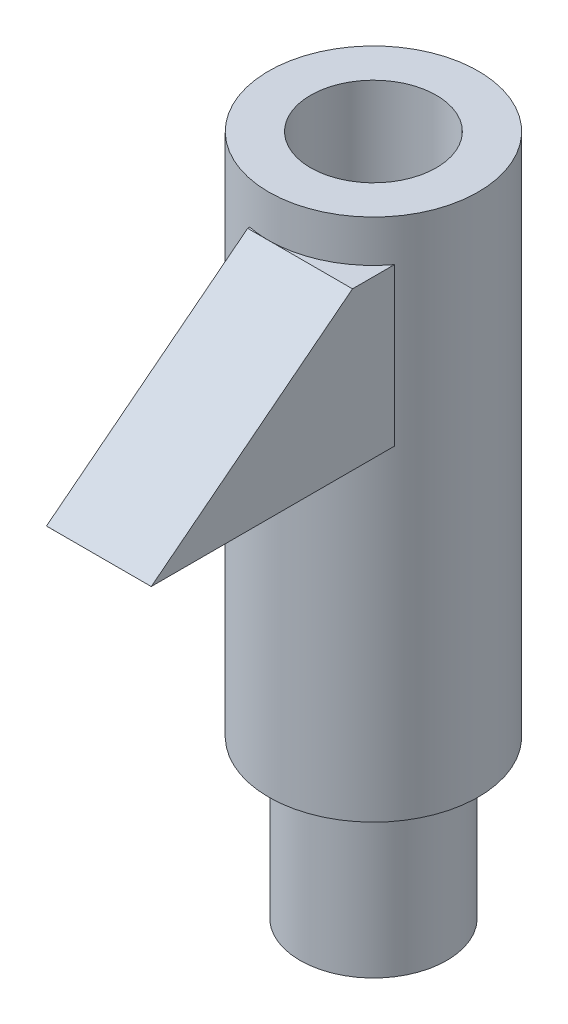
ISO-10303-21;
HEADER;
FILE_DESCRIPTION(('STEP AP214'),'2;1');
FILE_NAME('part.step','',(''),(''),'','','');
FILE_SCHEMA(('AUTOMOTIVE_DESIGN { 1 0 10303 214 1 1 1 1 }'));
ENDSEC;
DATA;
#1=APPLICATION_CONTEXT('core data for automotive mechanical design processes');
#2=APPLICATION_PROTOCOL_DEFINITION('international standard','automotive_design',2000,#1);
#3=PRODUCT_CONTEXT('',#1,'mechanical');
#4=PRODUCT('Part','Part','',(#3));
#5=PRODUCT_RELATED_PRODUCT_CATEGORY('part','',(#4));
#6=PRODUCT_DEFINITION_FORMATION('','',#4);
#7=PRODUCT_DEFINITION_CONTEXT('part definition',#1,'design');
#8=PRODUCT_DEFINITION('design','',#6,#7);
#9=PRODUCT_DEFINITION_SHAPE('','',#8);
#10=(LENGTH_UNIT() NAMED_UNIT(*) SI_UNIT(.MILLI.,.METRE.));
#11=(NAMED_UNIT(*) PLANE_ANGLE_UNIT() SI_UNIT($,.RADIAN.));
#12=(NAMED_UNIT(*) SI_UNIT($,.STERADIAN.) SOLID_ANGLE_UNIT());
#13=UNCERTAINTY_MEASURE_WITH_UNIT(LENGTH_MEASURE(1.E-05),#10,'distance_accuracy_value','');
#14=(GEOMETRIC_REPRESENTATION_CONTEXT(3) GLOBAL_UNCERTAINTY_ASSIGNED_CONTEXT((#13)) GLOBAL_UNIT_ASSIGNED_CONTEXT((#10,
#11,#12)) REPRESENTATION_CONTEXT('',''));
#15=CARTESIAN_POINT('',(0.,0.,0.));
#16=DIRECTION('',(0.,0.,1.));
#17=DIRECTION('',(1.,0.,0.));
#18=AXIS2_PLACEMENT_3D('',#15,#16,#17);
#19=CARTESIAN_POINT('',(-2.,61.,4.));
#20=DIRECTION('',(0.,1.,0.));
#21=DIRECTION('',(0.,0.,1.));
#22=AXIS2_PLACEMENT_3D('',#19,#20,#21);
#23=PLANE('',#22);
#24=DIRECTION('',(0.,0.,1.));
#25=VECTOR('',#24,1.);
#26=CARTESIAN_POINT('',(-2.,61.,4.));
#27=LINE('',#26,#25);
#28=CARTESIAN_POINT('',(-2.,61.,9.79795897113271));
#29=VERTEX_POINT('',#28);
#30=CARTESIAN_POINT('',(-2.,61.,9.99999999999983));
#31=VERTEX_POINT('',#30);
#32=EDGE_CURVE('E86',#29,#31,#27,.T.);
#33=ORIENTED_EDGE('',*,*,#32,.T.);
#34=DIRECTION('',(1.,0.,0.));
#35=VECTOR('',#34,1.);
#36=CARTESIAN_POINT('',(8.,61.,9.99999999999983));
#37=LINE('',#36,#35);
#38=CARTESIAN_POINT('',(0.,61.,9.99999999999983));
#39=VERTEX_POINT('',#38);
#40=EDGE_CURVE('E48',#31,#39,#37,.T.);
#41=ORIENTED_EDGE('',*,*,#40,.T.);
#42=CARTESIAN_POINT('',(0.,61.,0.));
#43=DIRECTION('',(0.,1.,0.));
#44=DIRECTION('',(0.,0.,1.));
#45=AXIS2_PLACEMENT_3D('',#42,#43,#44);
#46=CIRCLE('',#45,10.);
#47=EDGE_CURVE('E84',#29,#39,#46,.T.);
#48=ORIENTED_EDGE('',*,*,#47,.F.);
#49=EDGE_LOOP('',(#33,#41,#48));
#50=FACE_BOUND('',#49,.T.);
#51=ADVANCED_FACE('F39',(#50),#23,.T.);
#52=CARTESIAN_POINT('',(0.,15.,0.));
#53=DIRECTION('',(0.,-1.,0.));
#54=DIRECTION('',(0.,0.,-1.));
#55=AXIS2_PLACEMENT_3D('',#52,#53,#54);
#56=CYLINDRICAL_SURFACE('',#55,7.);
#57=CARTESIAN_POINT('',(0.,15.,0.));
#58=DIRECTION('',(0.,1.,0.));
#59=DIRECTION('',(0.,0.,1.));
#60=AXIS2_PLACEMENT_3D('',#57,#58,#59);
#61=CIRCLE('',#60,7.);
#62=CARTESIAN_POINT('',(0.,15.,7.));
#63=VERTEX_POINT('',#62);
#64=EDGE_CURVE('E176',#63,#63,#61,.T.);
#65=ORIENTED_EDGE('',*,*,#64,.F.);
#66=EDGE_LOOP('',(#65));
#67=FACE_BOUND('',#66,.T.);
#68=CARTESIAN_POINT('',(0.,0.,0.));
#69=DIRECTION('',(0.,1.,0.));
#70=DIRECTION('',(0.,0.,1.));
#71=AXIS2_PLACEMENT_3D('',#68,#69,#70);
#72=CIRCLE('',#71,7.);
#73=CARTESIAN_POINT('',(0.,0.,7.));
#74=VERTEX_POINT('',#73);
#75=EDGE_CURVE('E173',#74,#74,#72,.T.);
#76=ORIENTED_EDGE('',*,*,#75,.T.);
#77=EDGE_LOOP('',(#76));
#78=FACE_BOUND('',#77,.T.);
#79=ADVANCED_FACE('F144',(#67,#78),#56,.T.);
#80=CARTESIAN_POINT('',(0.,0.,0.));
#81=DIRECTION('',(0.,1.,0.));
#82=DIRECTION('',(0.,0.,1.));
#83=AXIS2_PLACEMENT_3D('',#80,#81,#82);
#84=PLANE('',#83);
#85=ORIENTED_EDGE('',*,*,#75,.F.);
#86=EDGE_LOOP('',(#85));
#87=FACE_BOUND('',#86,.T.);
#88=ADVANCED_FACE('F148',(#87),#84,.F.);
#89=CARTESIAN_POINT('',(0.,65.,0.));
#90=DIRECTION('',(0.,-1.,0.));
#91=DIRECTION('',(0.,0.,-1.));
#92=AXIS2_PLACEMENT_3D('',#89,#90,#91);
#93=CYLINDRICAL_SURFACE('',#92,10.);
#94=ORIENTED_EDGE('',*,*,#47,.T.);
#95=CARTESIAN_POINT('',(8.,61.,6.));
#96=VERTEX_POINT('',#95);
#97=EDGE_CURVE('E91',#39,#96,#46,.T.);
#98=ORIENTED_EDGE('',*,*,#97,.T.);
#99=DIRECTION('',(0.,-1.,0.));
#100=VECTOR('',#99,1.);
#101=CARTESIAN_POINT('',(8.,65.,6.));
#102=LINE('',#101,#100);
#103=CARTESIAN_POINT('',(8.,46.,6.));
#104=VERTEX_POINT('',#103);
#105=EDGE_CURVE('E111',#96,#104,#102,.T.);
#106=ORIENTED_EDGE('',*,*,#105,.T.);
#107=CARTESIAN_POINT('',(0.,46.,0.));
#108=DIRECTION('',(0.,-1.,0.));
#109=DIRECTION('',(0.,0.,-1.));
#110=AXIS2_PLACEMENT_3D('',#107,#108,#109);
#111=CIRCLE('',#110,10.);
#112=CARTESIAN_POINT('',(-2.,46.,9.79795897113271));
#113=VERTEX_POINT('',#112);
#114=EDGE_CURVE('E107',#104,#113,#111,.T.);
#115=ORIENTED_EDGE('',*,*,#114,.T.);
#116=DIRECTION('',(0.,-1.,0.));
#117=VECTOR('',#116,1.);
#118=CARTESIAN_POINT('',(-2.,65.,9.79795897113271));
#119=LINE('',#118,#117);
#120=EDGE_CURVE('E90',#113,#29,#119,.F.);
#121=ORIENTED_EDGE('',*,*,#120,.T.);
#122=EDGE_LOOP('',(#94,#98,#106,#115,#121));
#123=FACE_BOUND('',#122,.T.);
#124=CARTESIAN_POINT('',(0.,65.,0.));
#125=DIRECTION('',(0.,1.,0.));
#126=DIRECTION('',(0.,0.,1.));
#127=AXIS2_PLACEMENT_3D('',#124,#125,#126);
#128=CIRCLE('',#127,10.);
#129=CARTESIAN_POINT('',(0.,65.,10.));
#130=VERTEX_POINT('',#129);
#131=EDGE_CURVE('E177',#130,#130,#128,.T.);
#132=ORIENTED_EDGE('',*,*,#131,.F.);
#133=EDGE_LOOP('',(#132));
#134=FACE_BOUND('',#133,.T.);
#135=CARTESIAN_POINT('',(0.,15.,0.));
#136=DIRECTION('',(0.,1.,0.));
#137=DIRECTION('',(0.,0.,1.));
#138=AXIS2_PLACEMENT_3D('',#135,#136,#137);
#139=CIRCLE('',#138,10.);
#140=CARTESIAN_POINT('',(0.,15.,10.));
#141=VERTEX_POINT('',#140);
#142=EDGE_CURVE('E183',#141,#141,#139,.T.);
#143=ORIENTED_EDGE('',*,*,#142,.T.);
#144=EDGE_LOOP('',(#143));
#145=FACE_BOUND('',#144,.T.);
#146=ADVANCED_FACE('F104',(#123,#134,#145),#93,.T.);
#147=CARTESIAN_POINT('',(0.,65.,0.));
#148=DIRECTION('',(0.,1.,0.));
#149=DIRECTION('',(0.,0.,1.));
#150=AXIS2_PLACEMENT_3D('',#147,#148,#149);
#151=PLANE('',#150);
#152=CARTESIAN_POINT('',(0.,65.,0.));
#153=DIRECTION('',(0.,1.,0.));
#154=DIRECTION('',(0.,0.,1.));
#155=AXIS2_PLACEMENT_3D('',#152,#153,#154);
#156=CIRCLE('',#155,6.);
#157=CARTESIAN_POINT('',(0.,65.,6.));
#158=VERTEX_POINT('',#157);
#159=EDGE_CURVE('E194',#158,#158,#156,.T.);
#160=ORIENTED_EDGE('',*,*,#159,.F.);
#161=EDGE_LOOP('',(#160));
#162=FACE_BOUND('',#161,.T.);
#163=ORIENTED_EDGE('',*,*,#131,.T.);
#164=EDGE_LOOP('',(#163));
#165=FACE_BOUND('',#164,.T.);
#166=ADVANCED_FACE('F158',(#162,#165),#151,.T.);
#167=CARTESIAN_POINT('',(0.,15.,0.));
#168=DIRECTION('',(0.,1.,0.));
#169=DIRECTION('',(0.,0.,1.));
#170=AXIS2_PLACEMENT_3D('',#167,#168,#169);
#171=PLANE('',#170);
#172=ORIENTED_EDGE('',*,*,#64,.T.);
#173=EDGE_LOOP('',(#172));
#174=FACE_BOUND('',#173,.T.);
#175=ORIENTED_EDGE('',*,*,#142,.F.);
#176=EDGE_LOOP('',(#175));
#177=FACE_BOUND('',#176,.T.);
#178=ADVANCED_FACE('F156',(#174,#177),#171,.F.);
#179=CARTESIAN_POINT('',(8.,46.,4.));
#180=DIRECTION('',(1.,0.,0.));
#181=DIRECTION('',(0.,0.,-1.));
#182=AXIS2_PLACEMENT_3D('',#179,#180,#181);
#183=PLANE('',#182);
#184=DIRECTION('',(0.,0.,1.));
#185=VECTOR('',#184,1.);
#186=CARTESIAN_POINT('',(8.,61.,4.));
#187=LINE('',#186,#185);
#188=CARTESIAN_POINT('',(8.,61.,9.99999999999983));
#189=VERTEX_POINT('',#188);
#190=EDGE_CURVE('E101',#96,#189,#187,.T.);
#191=ORIENTED_EDGE('',*,*,#190,.T.);
#192=DIRECTION('',(0.,-0.615661475325663,0.788010753606718));
#193=VECTOR('',#192,1.);
#194=CARTESIAN_POINT('',(8.,58.2253013958253,13.551452260271));
#195=LINE('',#194,#193);
#196=CARTESIAN_POINT('',(8.,46.,29.1991244828958));
#197=VERTEX_POINT('',#196);
#198=EDGE_CURVE('E11',#189,#197,#195,.T.);
#199=ORIENTED_EDGE('',*,*,#198,.T.);
#200=DIRECTION('',(0.,0.,1.));
#201=VECTOR('',#200,1.);
#202=CARTESIAN_POINT('',(8.,46.,4.));
#203=LINE('',#202,#201);
#204=EDGE_CURVE('E129',#104,#197,#203,.T.);
#205=ORIENTED_EDGE('',*,*,#204,.F.);
#206=ORIENTED_EDGE('',*,*,#105,.F.);
#207=EDGE_LOOP('',(#191,#199,#205,#206));
#208=FACE_BOUND('',#207,.T.);
#209=ADVANCED_FACE('F153',(#208),#183,.T.);
#210=CARTESIAN_POINT('',(-2.,46.,4.));
#211=DIRECTION('',(-1.,0.,0.));
#212=DIRECTION('',(0.,0.,1.));
#213=AXIS2_PLACEMENT_3D('',#210,#211,#212);
#214=PLANE('',#213);
#215=DIRECTION('',(0.,0.,1.));
#216=VECTOR('',#215,1.);
#217=CARTESIAN_POINT('',(-2.,46.,4.));
#218=LINE('',#217,#216);
#219=CARTESIAN_POINT('',(-2.,46.,29.1991244828958));
#220=VERTEX_POINT('',#219);
#221=EDGE_CURVE('E100',#113,#220,#218,.T.);
#222=ORIENTED_EDGE('',*,*,#221,.T.);
#223=DIRECTION('',(0.,0.615661475325663,-0.788010753606718));
#224=VECTOR('',#223,1.);
#225=CARTESIAN_POINT('',(-2.,58.2253013958253,13.551452260271));
#226=LINE('',#225,#224);
#227=EDGE_CURVE('E98',#220,#31,#226,.T.);
#228=ORIENTED_EDGE('',*,*,#227,.T.);
#229=ORIENTED_EDGE('',*,*,#32,.F.);
#230=ORIENTED_EDGE('',*,*,#120,.F.);
#231=EDGE_LOOP('',(#222,#228,#229,#230));
#232=FACE_BOUND('',#231,.T.);
#233=ADVANCED_FACE('F95',(#232),#214,.T.);
#234=CARTESIAN_POINT('',(-2.,46.,4.));
#235=DIRECTION('',(0.,-1.,0.));
#236=DIRECTION('',(0.,0.,-1.));
#237=AXIS2_PLACEMENT_3D('',#234,#235,#236);
#238=PLANE('',#237);
#239=ORIENTED_EDGE('',*,*,#204,.T.);
#240=DIRECTION('',(-1.,0.,0.));
#241=VECTOR('',#240,1.);
#242=CARTESIAN_POINT('',(-2.,46.,29.1991244828958));
#243=LINE('',#242,#241);
#244=EDGE_CURVE('E117',#197,#220,#243,.T.);
#245=ORIENTED_EDGE('',*,*,#244,.T.);
#246=ORIENTED_EDGE('',*,*,#221,.F.);
#247=ORIENTED_EDGE('',*,*,#114,.F.);
#248=EDGE_LOOP('',(#239,#245,#246,#247));
#249=FACE_BOUND('',#248,.T.);
#250=ADVANCED_FACE('F127',(#249),#238,.T.);
#251=ORIENTED_EDGE('',*,*,#97,.F.);
#252=DIRECTION('',(1.,0.,0.));
#253=VECTOR('',#252,1.);
#254=CARTESIAN_POINT('',(8.,61.,9.99999999999983));
#255=LINE('',#254,#253);
#256=EDGE_CURVE('E55',#39,#189,#255,.T.);
#257=ORIENTED_EDGE('',*,*,#256,.T.);
#258=ORIENTED_EDGE('',*,*,#190,.F.);
#259=EDGE_LOOP('',(#251,#257,#258));
#260=FACE_BOUND('',#259,.T.);
#261=ADVANCED_FACE('F134',(#260),#23,.T.);
#262=CARTESIAN_POINT('',(0.,37.5614312047981,40.));
#263=DIRECTION('',(0.,0.788010753606718,0.615661475325663));
#264=DIRECTION('',(1.,0.,0.));
#265=AXIS2_PLACEMENT_3D('',#262,#263,#264);
#266=PLANE('',#265);
#267=ORIENTED_EDGE('',*,*,#256,.F.);
#268=ORIENTED_EDGE('',*,*,#40,.F.);
#269=ORIENTED_EDGE('',*,*,#227,.F.);
#270=ORIENTED_EDGE('',*,*,#244,.F.);
#271=ORIENTED_EDGE('',*,*,#198,.F.);
#272=EDGE_LOOP('',(#267,#268,#269,#270,#271));
#273=FACE_BOUND('',#272,.T.);
#274=ADVANCED_FACE('F41',(#273),#266,.T.);
#275=CARTESIAN_POINT('',(0.,45.,0.));
#276=DIRECTION('',(0.,1.,0.));
#277=DIRECTION('',(0.,0.,1.));
#278=AXIS2_PLACEMENT_3D('',#275,#276,#277);
#279=CYLINDRICAL_SURFACE('',#278,6.);
#280=CARTESIAN_POINT('',(0.,45.,0.));
#281=DIRECTION('',(0.,1.,0.));
#282=DIRECTION('',(0.,0.,1.));
#283=AXIS2_PLACEMENT_3D('',#280,#281,#282);
#284=CIRCLE('',#283,6.);
#285=CARTESIAN_POINT('',(0.,45.,6.));
#286=VERTEX_POINT('',#285);
#287=EDGE_CURVE('E190',#286,#286,#284,.T.);
#288=ORIENTED_EDGE('',*,*,#287,.F.);
#289=EDGE_LOOP('',(#288));
#290=FACE_BOUND('',#289,.T.);
#291=ORIENTED_EDGE('',*,*,#159,.T.);
#292=EDGE_LOOP('',(#291));
#293=FACE_BOUND('',#292,.T.);
#294=ADVANCED_FACE('F133',(#290,#293),#279,.F.);
#295=CARTESIAN_POINT('',(0.,45.,0.));
#296=DIRECTION('',(0.,1.,0.));
#297=DIRECTION('',(0.,0.,1.));
#298=AXIS2_PLACEMENT_3D('',#295,#296,#297);
#299=PLANE('',#298);
#300=ORIENTED_EDGE('',*,*,#287,.T.);
#301=EDGE_LOOP('',(#300));
#302=FACE_BOUND('',#301,.T.);
#303=ADVANCED_FACE('F139',(#302),#299,.T.);
#304=CLOSED_SHELL('',(#51,#79,#88,#146,#166,#178,#209,#233,#250,#261,#274,#294,#303));
#305=MANIFOLD_SOLID_BREP('B2',#304);
#306=ADVANCED_BREP_SHAPE_REPRESENTATION('',(#18,#305),#14);
#307=SHAPE_DEFINITION_REPRESENTATION(#9,#306);
ENDSEC;
END-ISO-10303-21;
